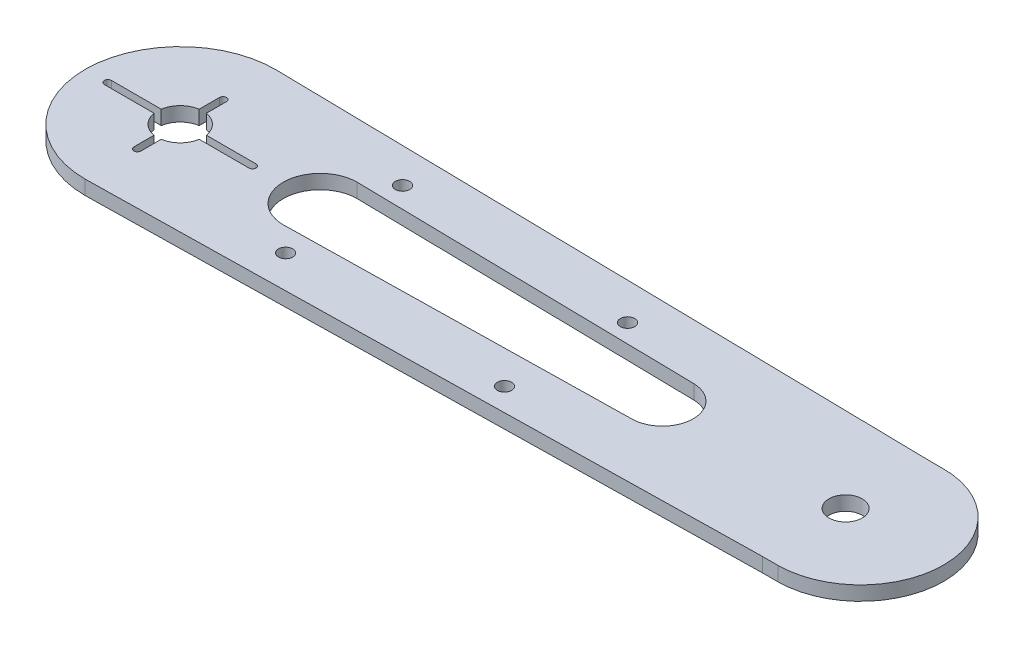
ISO-10303-21;
HEADER;
FILE_DESCRIPTION(('STEP AP214'),'2;1');
FILE_NAME('part.step','',(''),(''),'','','');
FILE_SCHEMA(('AUTOMOTIVE_DESIGN { 1 0 10303 214 1 1 1 1 }'));
ENDSEC;
DATA;
#1=APPLICATION_CONTEXT('core data for automotive mechanical design processes');
#2=APPLICATION_PROTOCOL_DEFINITION('international standard','automotive_design',2000,#1);
#3=PRODUCT_CONTEXT('',#1,'mechanical');
#4=PRODUCT('Part','Part','',(#3));
#5=PRODUCT_RELATED_PRODUCT_CATEGORY('part','',(#4));
#6=PRODUCT_DEFINITION_FORMATION('','',#4);
#7=PRODUCT_DEFINITION_CONTEXT('part definition',#1,'design');
#8=PRODUCT_DEFINITION('design','',#6,#7);
#9=PRODUCT_DEFINITION_SHAPE('','',#8);
#10=(LENGTH_UNIT() NAMED_UNIT(*) SI_UNIT(.MILLI.,.METRE.));
#11=(NAMED_UNIT(*) PLANE_ANGLE_UNIT() SI_UNIT($,.RADIAN.));
#12=(NAMED_UNIT(*) SI_UNIT($,.STERADIAN.) SOLID_ANGLE_UNIT());
#13=UNCERTAINTY_MEASURE_WITH_UNIT(LENGTH_MEASURE(1.E-05),#10,'distance_accuracy_value','');
#14=(GEOMETRIC_REPRESENTATION_CONTEXT(3) GLOBAL_UNCERTAINTY_ASSIGNED_CONTEXT((#13)) GLOBAL_UNIT_ASSIGNED_CONTEXT((#10,
#11,#12)) REPRESENTATION_CONTEXT('',''));
#15=CARTESIAN_POINT('',(0.,0.,0.));
#16=DIRECTION('',(0.,0.,1.));
#17=DIRECTION('',(1.,0.,0.));
#18=AXIS2_PLACEMENT_3D('',#15,#16,#17);
#19=CARTESIAN_POINT('',(0.,3.,0.));
#20=DIRECTION('',(0.,1.,0.));
#21=DIRECTION('',(0.,0.,1.));
#22=AXIS2_PLACEMENT_3D('',#19,#20,#21);
#23=PLANE('',#22);
#24=CARTESIAN_POINT('',(34.5416560076669,3.,-12.2314747346436));
#25=DIRECTION('',(0.,1.,0.));
#26=DIRECTION('',(0.,0.,1.));
#27=AXIS2_PLACEMENT_3D('',#24,#25,#26);
#28=CIRCLE('',#27,1.5);
#29=CARTESIAN_POINT('',(34.5416560076669,3.,-10.7314747346435));
#30=VERTEX_POINT('',#29);
#31=EDGE_CURVE('E314',#30,#30,#28,.T.);
#32=ORIENTED_EDGE('',*,*,#31,.F.);
#33=EDGE_LOOP('',(#32));
#34=FACE_BOUND('',#33,.T.);
#35=CARTESIAN_POINT('',(83.1945600648679,3.,-10.9224438629721));
#36=DIRECTION('',(0.,1.,0.));
#37=DIRECTION('',(0.,0.,1.));
#38=AXIS2_PLACEMENT_3D('',#35,#36,#37);
#39=CIRCLE('',#38,1.5);
#40=CARTESIAN_POINT('',(83.1945600648679,3.,-9.42244386297211));
#41=VERTEX_POINT('',#40);
#42=EDGE_CURVE('E321',#41,#41,#39,.T.);
#43=ORIENTED_EDGE('',*,*,#42,.F.);
#44=EDGE_LOOP('',(#43));
#45=FACE_BOUND('',#44,.T.);
#46=CARTESIAN_POINT('',(81.8715113944771,3.,13.6467101056128));
#47=DIRECTION('',(0.,1.,0.));
#48=DIRECTION('',(0.,0.,1.));
#49=AXIS2_PLACEMENT_3D('',#46,#47,#48);
#50=CIRCLE('',#49,1.5);
#51=CARTESIAN_POINT('',(81.8715113944771,3.,15.1467101056128));
#52=VERTEX_POINT('',#51);
#53=EDGE_CURVE('E316',#52,#52,#50,.T.);
#54=ORIENTED_EDGE('',*,*,#53,.F.);
#55=EDGE_LOOP('',(#54));
#56=FACE_BOUND('',#55,.T.);
#57=CARTESIAN_POINT('',(34.5416560076669,3.,12.373276524336));
#58=DIRECTION('',(0.,1.,0.));
#59=DIRECTION('',(0.,0.,1.));
#60=AXIS2_PLACEMENT_3D('',#57,#58,#59);
#61=CIRCLE('',#60,1.5);
#62=CARTESIAN_POINT('',(34.5416560076669,3.,13.873276524336));
#63=VERTEX_POINT('',#62);
#64=EDGE_CURVE('E320',#63,#63,#61,.T.);
#65=ORIENTED_EDGE('',*,*,#64,.F.);
#66=EDGE_LOOP('',(#65));
#67=FACE_BOUND('',#66,.T.);
#68=CARTESIAN_POINT('',(140.,3.,0.));
#69=DIRECTION('',(0.,1.,0.));
#70=DIRECTION('',(0.,0.,1.));
#71=AXIS2_PLACEMENT_3D('',#68,#69,#70);
#72=CIRCLE('',#71,3.49999999999999);
#73=CARTESIAN_POINT('',(140.,3.,3.49999999999999));
#74=VERTEX_POINT('',#73);
#75=EDGE_CURVE('E337',#74,#74,#72,.T.);
#76=ORIENTED_EDGE('',*,*,#75,.F.);
#77=EDGE_LOOP('',(#76));
#78=FACE_BOUND('',#77,.T.);
#79=DIRECTION('',(-0.999840599345445,0.,0.0178542964168829));
#80=VECTOR('',#79,1.);
#81=CARTESIAN_POINT('',(0.357029008606949,3.,19.9936244819892));
#82=LINE('',#81,#80);
#83=CARTESIAN_POINT('',(140.,3.,17.5));
#84=VERTEX_POINT('',#83);
#85=CARTESIAN_POINT('',(0.,3.,20.));
#86=VERTEX_POINT('',#85);
#87=EDGE_CURVE('E504',#84,#86,#82,.T.);
#88=ORIENTED_EDGE('',*,*,#87,.F.);
#89=DIRECTION('',(1.,0.,0.));
#90=VECTOR('',#89,1.);
#91=CARTESIAN_POINT('',(143.30110747715,3.,17.5));
#92=LINE('',#91,#90);
#93=CARTESIAN_POINT('',(143.30110747715,3.,17.5));
#94=VERTEX_POINT('',#93);
#95=EDGE_CURVE('E299',#84,#94,#92,.T.);
#96=ORIENTED_EDGE('',*,*,#95,.T.);
#97=CARTESIAN_POINT('',(143.13337203176,3.,0.000803880738995593));
#98=DIRECTION('',(0.,1.,0.));
#99=DIRECTION('',(0.,0.,1.));
#100=AXIS2_PLACEMENT_3D('',#97,#98,#99);
#101=CIRCLE('',#100,17.5);
#102=CARTESIAN_POINT('',(142.869697489549,3.,-17.4972095989618));
#103=VERTEX_POINT('',#102);
#104=EDGE_CURVE('E308',#94,#103,#101,.T.);
#105=ORIENTED_EDGE('',*,*,#104,.T.);
#106=DIRECTION('',(-1.,0.,0.));
#107=VECTOR('',#106,1.);
#108=CARTESIAN_POINT('',(140.3125,3.,-17.4972095989618));
#109=LINE('',#108,#107);
#110=CARTESIAN_POINT('',(140.3125,3.,-17.4972095989618));
#111=VERTEX_POINT('',#110);
#112=EDGE_CURVE('E274',#103,#111,#109,.T.);
#113=ORIENTED_EDGE('',*,*,#112,.T.);
#114=DIRECTION('',(0.999840548512101,0.,0.0178571428571428));
#115=VECTOR('',#114,1.);
#116=CARTESIAN_POINT('',(0.357142857142856,3.,-19.996810970242));
#117=LINE('',#116,#115);
#118=CARTESIAN_POINT('',(0.357142857142857,3.,-19.996810970242));
#119=VERTEX_POINT('',#118);
#120=EDGE_CURVE('E508',#119,#111,#117,.T.);
#121=ORIENTED_EDGE('',*,*,#120,.F.);
#122=CARTESIAN_POINT('',(0.,3.,0.));
#123=DIRECTION('',(0.,1.,0.));
#124=DIRECTION('',(0.,0.,1.));
#125=AXIS2_PLACEMENT_3D('',#122,#123,#124);
#126=CIRCLE('',#125,20.);
#127=EDGE_CURVE('E513',#119,#86,#126,.T.);
#128=ORIENTED_EDGE('',*,*,#127,.T.);
#129=EDGE_LOOP('',(#88,#96,#105,#113,#121,#128));
#130=FACE_BOUND('',#129,.T.);
#131=DIRECTION('',(-0.999840548512101,0.,-0.0178571428571486));
#132=VECTOR('',#131,1.);
#133=CARTESIAN_POINT('',(0.153184026665754,3.,-8.57693766970494));
#134=LINE('',#133,#132);
#135=CARTESIAN_POINT('',(101.283865866767,3.,-6.77074463667885));
#136=VERTEX_POINT('',#135);
#137=CARTESIAN_POINT('',(29.1730446968037,3.,-8.05864322920403));
#138=VERTEX_POINT('',#137);
#139=EDGE_CURVE('E468',#136,#138,#134,.T.);
#140=ORIENTED_EDGE('',*,*,#139,.F.);
#141=CARTESIAN_POINT('',(101.157834128344,3.,-0.288766187509077));
#142=DIRECTION('',(0.,1.,0.));
#143=DIRECTION('',(0.,0.,1.));
#144=AXIS2_PLACEMENT_3D('',#141,#142,#143);
#145=CIRCLE('',#144,6.48320357651921);
#146=CARTESIAN_POINT('',(101.494647455368,3.,6.18568246834806));
#147=VERTEX_POINT('',#146);
#148=EDGE_CURVE('E369',#136,#147,#145,.F.);
#149=ORIENTED_EDGE('',*,*,#148,.T.);
#150=DIRECTION('',(0.999840599345445,0.,-0.0178542964168771));
#151=VECTOR('',#150,1.);
#152=CARTESIAN_POINT('',(0.142777451604297,3.,7.99553728984324));
#153=LINE('',#152,#151);
#154=CARTESIAN_POINT('',(29.1575998035354,3.,7.47741546213036));
#155=VERTEX_POINT('',#154);
#156=EDGE_CURVE('E452',#155,#147,#153,.T.);
#157=ORIENTED_EDGE('',*,*,#156,.F.);
#158=CARTESIAN_POINT('',(29.1653222501695,3.,-0.290613883536413));
#159=DIRECTION('',(0.,1.,0.));
#160=DIRECTION('',(0.,0.,1.));
#161=AXIS2_PLACEMENT_3D('',#158,#159,#160);
#162=CIRCLE('',#161,7.76803318423194);
#163=EDGE_CURVE('E472',#138,#155,#162,.T.);
#164=ORIENTED_EDGE('',*,*,#163,.F.);
#165=EDGE_LOOP('',(#140,#149,#157,#164));
#166=FACE_BOUND('',#165,.T.);
#167=CARTESIAN_POINT('',(0.,3.,0.));
#168=DIRECTION('',(0.,1.,0.));
#169=DIRECTION('',(0.,0.,1.));
#170=AXIS2_PLACEMENT_3D('',#167,#168,#169);
#171=CIRCLE('',#170,4.8);
#172=CARTESIAN_POINT('',(-4.74104418878373,3.,0.75));
#173=VERTEX_POINT('',#172);
#174=CARTESIAN_POINT('',(-0.749999999999998,3.,4.74104418878373));
#175=VERTEX_POINT('',#174);
#176=EDGE_CURVE('E482',#173,#175,#171,.T.);
#177=ORIENTED_EDGE('',*,*,#176,.F.);
#178=DIRECTION('',(1.,0.,0.));
#179=VECTOR('',#178,1.);
#180=CARTESIAN_POINT('',(0.,3.,0.75));
#181=LINE('',#180,#179);
#182=CARTESIAN_POINT('',(-15.22,3.,0.75));
#183=VERTEX_POINT('',#182);
#184=EDGE_CURVE('E349',#183,#173,#181,.T.);
#185=ORIENTED_EDGE('',*,*,#184,.F.);
#186=CARTESIAN_POINT('',(-15.22,3.,0.));
#187=DIRECTION('',(0.,1.,0.));
#188=DIRECTION('',(0.,0.,1.));
#189=AXIS2_PLACEMENT_3D('',#186,#187,#188);
#190=CIRCLE('',#189,0.75);
#191=CARTESIAN_POINT('',(-15.22,3.,-0.75));
#192=VERTEX_POINT('',#191);
#193=EDGE_CURVE('E345',#192,#183,#190,.T.);
#194=ORIENTED_EDGE('',*,*,#193,.F.);
#195=DIRECTION('',(1.,0.,0.));
#196=VECTOR('',#195,1.);
#197=CARTESIAN_POINT('',(0.,3.,-0.75));
#198=LINE('',#197,#196);
#199=CARTESIAN_POINT('',(-4.74104418878373,3.,-0.75));
#200=VERTEX_POINT('',#199);
#201=EDGE_CURVE('E341',#192,#200,#198,.T.);
#202=ORIENTED_EDGE('',*,*,#201,.T.);
#203=CARTESIAN_POINT('',(-0.749999999999998,3.,-4.74104418878373));
#204=VERTEX_POINT('',#203);
#205=EDGE_CURVE('E764',#204,#200,#171,.T.);
#206=ORIENTED_EDGE('',*,*,#205,.F.);
#207=DIRECTION('',(0.,0.,-1.));
#208=VECTOR('',#207,1.);
#209=CARTESIAN_POINT('',(-0.749999999999998,3.,0.));
#210=LINE('',#209,#208);
#211=CARTESIAN_POINT('',(-0.749999999999998,3.,-9.));
#212=VERTEX_POINT('',#211);
#213=EDGE_CURVE('E110',#204,#212,#210,.T.);
#214=ORIENTED_EDGE('',*,*,#213,.T.);
#215=CARTESIAN_POINT('',(0.,3.,-9.));
#216=DIRECTION('',(0.,1.,0.));
#217=DIRECTION('',(0.,0.,1.));
#218=AXIS2_PLACEMENT_3D('',#215,#216,#217);
#219=CIRCLE('',#218,0.75);
#220=CARTESIAN_POINT('',(0.750000000000001,3.,-9.));
#221=VERTEX_POINT('',#220);
#222=EDGE_CURVE('E373',#221,#212,#219,.T.);
#223=ORIENTED_EDGE('',*,*,#222,.F.);
#224=DIRECTION('',(0.,0.,-1.));
#225=VECTOR('',#224,1.);
#226=CARTESIAN_POINT('',(0.750000000000001,3.,0.));
#227=LINE('',#226,#225);
#228=CARTESIAN_POINT('',(0.750000000000001,3.,-4.74104418878373));
#229=VERTEX_POINT('',#228);
#230=EDGE_CURVE('E370',#229,#221,#227,.T.);
#231=ORIENTED_EDGE('',*,*,#230,.F.);
#232=CARTESIAN_POINT('',(4.74104418878373,3.,-0.75));
#233=VERTEX_POINT('',#232);
#234=EDGE_CURVE('E503',#233,#229,#171,.T.);
#235=ORIENTED_EDGE('',*,*,#234,.F.);
#236=DIRECTION('',(1.,0.,0.));
#237=VECTOR('',#236,1.);
#238=CARTESIAN_POINT('',(-15.22,3.,-0.75));
#239=LINE('',#238,#237);
#240=CARTESIAN_POINT('',(15.22,3.,-0.75));
#241=VERTEX_POINT('',#240);
#242=EDGE_CURVE('E118',#233,#241,#239,.T.);
#243=ORIENTED_EDGE('',*,*,#242,.T.);
#244=CARTESIAN_POINT('',(15.22,3.,0.));
#245=DIRECTION('',(0.,1.,0.));
#246=DIRECTION('',(0.,0.,1.));
#247=AXIS2_PLACEMENT_3D('',#244,#245,#246);
#248=CIRCLE('',#247,0.75);
#249=CARTESIAN_POINT('',(15.22,3.,0.75));
#250=VERTEX_POINT('',#249);
#251=EDGE_CURVE('E427',#250,#241,#248,.T.);
#252=ORIENTED_EDGE('',*,*,#251,.F.);
#253=DIRECTION('',(1.,0.,0.));
#254=VECTOR('',#253,1.);
#255=CARTESIAN_POINT('',(-15.22,3.,0.75));
#256=LINE('',#255,#254);
#257=CARTESIAN_POINT('',(4.74104418878373,3.,0.75));
#258=VERTEX_POINT('',#257);
#259=EDGE_CURVE('E424',#258,#250,#256,.T.);
#260=ORIENTED_EDGE('',*,*,#259,.F.);
#261=CARTESIAN_POINT('',(0.750000000000001,3.,4.74104418878373));
#262=VERTEX_POINT('',#261);
#263=EDGE_CURVE('E499',#262,#258,#171,.T.);
#264=ORIENTED_EDGE('',*,*,#263,.F.);
#265=DIRECTION('',(0.,0.,-1.));
#266=VECTOR('',#265,1.);
#267=CARTESIAN_POINT('',(0.750000000000001,3.,0.));
#268=LINE('',#267,#266);
#269=CARTESIAN_POINT('',(0.750000000000001,3.,9.));
#270=VERTEX_POINT('',#269);
#271=EDGE_CURVE('E405',#270,#262,#268,.T.);
#272=ORIENTED_EDGE('',*,*,#271,.F.);
#273=CARTESIAN_POINT('',(0.,3.,9.));
#274=DIRECTION('',(0.,1.,0.));
#275=DIRECTION('',(0.,0.,1.));
#276=AXIS2_PLACEMENT_3D('',#273,#274,#275);
#277=CIRCLE('',#276,0.75);
#278=CARTESIAN_POINT('',(-0.749999999999998,3.,9.));
#279=VERTEX_POINT('',#278);
#280=EDGE_CURVE('E401',#279,#270,#277,.T.);
#281=ORIENTED_EDGE('',*,*,#280,.F.);
#282=DIRECTION('',(0.,0.,-1.));
#283=VECTOR('',#282,1.);
#284=CARTESIAN_POINT('',(-0.749999999999998,3.,0.));
#285=LINE('',#284,#283);
#286=EDGE_CURVE('E397',#279,#175,#285,.T.);
#287=ORIENTED_EDGE('',*,*,#286,.T.);
#288=EDGE_LOOP('',(#177,#185,#194,#202,#206,#214,#223,#231,#235,#243,#252,#260,#264,#272,#281,#287));
#289=FACE_BOUND('',#288,.T.);
#290=ADVANCED_FACE('F92',(#34,#45,#56,#67,#78,#130,#166,#289),#23,.T.);
#291=CARTESIAN_POINT('',(0.,0.,0.));
#292=DIRECTION('',(0.,1.,0.));
#293=DIRECTION('',(0.,0.,1.));
#294=AXIS2_PLACEMENT_3D('',#291,#292,#293);
#295=PLANE('',#294);
#296=CARTESIAN_POINT('',(34.5416560076669,0.,-12.2314747346436));
#297=DIRECTION('',(0.,1.,0.));
#298=DIRECTION('',(0.,0.,1.));
#299=AXIS2_PLACEMENT_3D('',#296,#297,#298);
#300=CIRCLE('',#299,1.5);
#301=CARTESIAN_POINT('',(34.5416560076669,0.,-10.7314747346435));
#302=VERTEX_POINT('',#301);
#303=EDGE_CURVE('E96',#302,#302,#300,.T.);
#304=ORIENTED_EDGE('',*,*,#303,.T.);
#305=EDGE_LOOP('',(#304));
#306=FACE_BOUND('',#305,.T.);
#307=CARTESIAN_POINT('',(83.1945600648679,0.,-10.9224438629721));
#308=DIRECTION('',(0.,1.,0.));
#309=DIRECTION('',(0.,0.,1.));
#310=AXIS2_PLACEMENT_3D('',#307,#308,#309);
#311=CIRCLE('',#310,1.5);
#312=CARTESIAN_POINT('',(83.1945600648679,0.,-9.42244386297211));
#313=VERTEX_POINT('',#312);
#314=EDGE_CURVE('E563',#313,#313,#311,.T.);
#315=ORIENTED_EDGE('',*,*,#314,.T.);
#316=EDGE_LOOP('',(#315));
#317=FACE_BOUND('',#316,.T.);
#318=CARTESIAN_POINT('',(81.8715113944771,0.,13.6467101056128));
#319=DIRECTION('',(0.,1.,0.));
#320=DIRECTION('',(0.,0.,1.));
#321=AXIS2_PLACEMENT_3D('',#318,#319,#320);
#322=CIRCLE('',#321,1.5);
#323=CARTESIAN_POINT('',(81.8715113944771,0.,15.1467101056128));
#324=VERTEX_POINT('',#323);
#325=EDGE_CURVE('E560',#324,#324,#322,.T.);
#326=ORIENTED_EDGE('',*,*,#325,.T.);
#327=EDGE_LOOP('',(#326));
#328=FACE_BOUND('',#327,.T.);
#329=CARTESIAN_POINT('',(34.5416560076669,0.,12.373276524336));
#330=DIRECTION('',(0.,1.,0.));
#331=DIRECTION('',(0.,0.,1.));
#332=AXIS2_PLACEMENT_3D('',#329,#330,#331);
#333=CIRCLE('',#332,1.5);
#334=CARTESIAN_POINT('',(34.5416560076669,0.,13.873276524336));
#335=VERTEX_POINT('',#334);
#336=EDGE_CURVE('E331',#335,#335,#333,.T.);
#337=ORIENTED_EDGE('',*,*,#336,.T.);
#338=EDGE_LOOP('',(#337));
#339=FACE_BOUND('',#338,.T.);
#340=CARTESIAN_POINT('',(140.,0.,0.));
#341=DIRECTION('',(0.,1.,0.));
#342=DIRECTION('',(0.,0.,1.));
#343=AXIS2_PLACEMENT_3D('',#340,#341,#342);
#344=CIRCLE('',#343,3.49999999999999);
#345=CARTESIAN_POINT('',(140.,0.,3.49999999999999));
#346=VERTEX_POINT('',#345);
#347=EDGE_CURVE('E332',#346,#346,#344,.T.);
#348=ORIENTED_EDGE('',*,*,#347,.T.);
#349=EDGE_LOOP('',(#348));
#350=FACE_BOUND('',#349,.T.);
#351=DIRECTION('',(-0.999840599345445,0.,0.0178542964168829));
#352=VECTOR('',#351,1.);
#353=CARTESIAN_POINT('',(0.357029008606949,0.,19.9936244819892));
#354=LINE('',#353,#352);
#355=CARTESIAN_POINT('',(140.,0.,17.5));
#356=VERTEX_POINT('',#355);
#357=CARTESIAN_POINT('',(0.,0.,20.));
#358=VERTEX_POINT('',#357);
#359=EDGE_CURVE('E496',#356,#358,#354,.T.);
#360=ORIENTED_EDGE('',*,*,#359,.T.);
#361=CARTESIAN_POINT('',(0.,0.,0.));
#362=DIRECTION('',(0.,1.,0.));
#363=DIRECTION('',(0.,0.,1.));
#364=AXIS2_PLACEMENT_3D('',#361,#362,#363);
#365=CIRCLE('',#364,20.);
#366=CARTESIAN_POINT('',(0.357142857142857,0.,-19.996810970242));
#367=VERTEX_POINT('',#366);
#368=EDGE_CURVE('E509',#367,#358,#365,.T.);
#369=ORIENTED_EDGE('',*,*,#368,.F.);
#370=DIRECTION('',(0.999840548512101,0.,0.0178571428571428));
#371=VECTOR('',#370,1.);
#372=CARTESIAN_POINT('',(0.357142857142856,0.,-19.996810970242));
#373=LINE('',#372,#371);
#374=CARTESIAN_POINT('',(140.3125,0.,-17.4972095989618));
#375=VERTEX_POINT('',#374);
#376=EDGE_CURVE('E294',#367,#375,#373,.T.);
#377=ORIENTED_EDGE('',*,*,#376,.T.);
#378=DIRECTION('',(-1.,0.,0.));
#379=VECTOR('',#378,1.);
#380=CARTESIAN_POINT('',(140.3125,0.,-17.4972095989618));
#381=LINE('',#380,#379);
#382=CARTESIAN_POINT('',(142.869697489549,0.,-17.4972095989618));
#383=VERTEX_POINT('',#382);
#384=EDGE_CURVE('E271',#383,#375,#381,.T.);
#385=ORIENTED_EDGE('',*,*,#384,.F.);
#386=CARTESIAN_POINT('',(143.13337203176,0.,0.000803880738995593));
#387=DIRECTION('',(0.,1.,0.));
#388=DIRECTION('',(0.,0.,1.));
#389=AXIS2_PLACEMENT_3D('',#386,#387,#388);
#390=CIRCLE('',#389,17.5);
#391=CARTESIAN_POINT('',(143.30110747715,0.,17.5));
#392=VERTEX_POINT('',#391);
#393=EDGE_CURVE('E290',#392,#383,#390,.T.);
#394=ORIENTED_EDGE('',*,*,#393,.F.);
#395=DIRECTION('',(1.,0.,0.));
#396=VECTOR('',#395,1.);
#397=CARTESIAN_POINT('',(143.30110747715,0.,17.5));
#398=LINE('',#397,#396);
#399=EDGE_CURVE('E281',#356,#392,#398,.T.);
#400=ORIENTED_EDGE('',*,*,#399,.F.);
#401=EDGE_LOOP('',(#360,#369,#377,#385,#394,#400));
#402=FACE_BOUND('',#401,.T.);
#403=CARTESIAN_POINT('',(101.157834128344,0.,-0.288766187509077));
#404=DIRECTION('',(0.,1.,0.));
#405=DIRECTION('',(0.,0.,1.));
#406=AXIS2_PLACEMENT_3D('',#403,#404,#405);
#407=CIRCLE('',#406,6.48320357651921);
#408=CARTESIAN_POINT('',(101.283865866767,0.,-6.77074463667885));
#409=VERTEX_POINT('',#408);
#410=CARTESIAN_POINT('',(101.494647455368,0.,6.18568246834806));
#411=VERTEX_POINT('',#410);
#412=EDGE_CURVE('E448',#409,#411,#407,.F.);
#413=ORIENTED_EDGE('',*,*,#412,.F.);
#414=DIRECTION('',(-0.999840548512101,0.,-0.0178571428571486));
#415=VECTOR('',#414,1.);
#416=CARTESIAN_POINT('',(0.153184026665754,0.,-8.57693766970494));
#417=LINE('',#416,#415);
#418=CARTESIAN_POINT('',(29.1730446968037,0.,-8.05864322920403));
#419=VERTEX_POINT('',#418);
#420=EDGE_CURVE('E451',#409,#419,#417,.T.);
#421=ORIENTED_EDGE('',*,*,#420,.T.);
#422=CARTESIAN_POINT('',(29.1653222501695,0.,-0.290613883536413));
#423=DIRECTION('',(0.,1.,0.));
#424=DIRECTION('',(0.,0.,1.));
#425=AXIS2_PLACEMENT_3D('',#422,#423,#424);
#426=CIRCLE('',#425,7.76803318423194);
#427=CARTESIAN_POINT('',(29.1575998035354,0.,7.47741546213036));
#428=VERTEX_POINT('',#427);
#429=EDGE_CURVE('E456',#419,#428,#426,.T.);
#430=ORIENTED_EDGE('',*,*,#429,.T.);
#431=DIRECTION('',(0.999840599345445,0.,-0.0178542964168771));
#432=VECTOR('',#431,1.);
#433=CARTESIAN_POINT('',(0.142777451604297,0.,7.99553728984324));
#434=LINE('',#433,#432);
#435=EDGE_CURVE('E460',#428,#411,#434,.T.);
#436=ORIENTED_EDGE('',*,*,#435,.T.);
#437=EDGE_LOOP('',(#413,#421,#430,#436));
#438=FACE_BOUND('',#437,.T.);
#439=DIRECTION('',(1.,0.,0.));
#440=VECTOR('',#439,1.);
#441=CARTESIAN_POINT('',(0.,0.,0.75));
#442=LINE('',#441,#440);
#443=CARTESIAN_POINT('',(-15.22,0.,0.75));
#444=VERTEX_POINT('',#443);
#445=CARTESIAN_POINT('',(-4.74104418878373,0.,0.75));
#446=VERTEX_POINT('',#445);
#447=EDGE_CURVE('E346',#444,#446,#442,.T.);
#448=ORIENTED_EDGE('',*,*,#447,.T.);
#449=CARTESIAN_POINT('',(0.,0.,0.));
#450=DIRECTION('',(0.,1.,0.));
#451=DIRECTION('',(0.,0.,1.));
#452=AXIS2_PLACEMENT_3D('',#449,#450,#451);
#453=CIRCLE('',#452,4.8);
#454=CARTESIAN_POINT('',(-0.749999999999998,0.,4.74104418878373));
#455=VERTEX_POINT('',#454);
#456=EDGE_CURVE('E498',#446,#455,#453,.T.);
#457=ORIENTED_EDGE('',*,*,#456,.T.);
#458=DIRECTION('',(0.,0.,-1.));
#459=VECTOR('',#458,1.);
#460=CARTESIAN_POINT('',(-0.749999999999998,0.,0.));
#461=LINE('',#460,#459);
#462=CARTESIAN_POINT('',(-0.749999999999998,0.,9.));
#463=VERTEX_POINT('',#462);
#464=EDGE_CURVE('E409',#463,#455,#461,.T.);
#465=ORIENTED_EDGE('',*,*,#464,.F.);
#466=CARTESIAN_POINT('',(0.,0.,9.));
#467=DIRECTION('',(0.,1.,0.));
#468=DIRECTION('',(0.,0.,1.));
#469=AXIS2_PLACEMENT_3D('',#466,#467,#468);
#470=CIRCLE('',#469,0.75);
#471=CARTESIAN_POINT('',(0.750000000000001,0.,9.));
#472=VERTEX_POINT('',#471);
#473=EDGE_CURVE('E412',#463,#472,#470,.T.);
#474=ORIENTED_EDGE('',*,*,#473,.T.);
#475=DIRECTION('',(0.,0.,-1.));
#476=VECTOR('',#475,1.);
#477=CARTESIAN_POINT('',(0.750000000000001,0.,0.));
#478=LINE('',#477,#476);
#479=CARTESIAN_POINT('',(0.750000000000001,0.,4.74104418878373));
#480=VERTEX_POINT('',#479);
#481=EDGE_CURVE('E402',#472,#480,#478,.T.);
#482=ORIENTED_EDGE('',*,*,#481,.T.);
#483=CARTESIAN_POINT('',(4.74104418878373,0.,0.75));
#484=VERTEX_POINT('',#483);
#485=EDGE_CURVE('E492',#480,#484,#453,.T.);
#486=ORIENTED_EDGE('',*,*,#485,.T.);
#487=DIRECTION('',(1.,0.,0.));
#488=VECTOR('',#487,1.);
#489=CARTESIAN_POINT('',(-15.22,0.,0.75));
#490=LINE('',#489,#488);
#491=CARTESIAN_POINT('',(15.22,0.,0.75));
#492=VERTEX_POINT('',#491);
#493=EDGE_CURVE('E336',#484,#492,#490,.T.);
#494=ORIENTED_EDGE('',*,*,#493,.T.);
#495=CARTESIAN_POINT('',(15.22,0.,0.));
#496=DIRECTION('',(0.,1.,0.));
#497=DIRECTION('',(0.,0.,1.));
#498=AXIS2_PLACEMENT_3D('',#495,#496,#497);
#499=CIRCLE('',#498,0.75);
#500=CARTESIAN_POINT('',(15.22,0.,-0.75));
#501=VERTEX_POINT('',#500);
#502=EDGE_CURVE('E437',#492,#501,#499,.T.);
#503=ORIENTED_EDGE('',*,*,#502,.T.);
#504=DIRECTION('',(1.,0.,0.));
#505=VECTOR('',#504,1.);
#506=CARTESIAN_POINT('',(-15.22,0.,-0.75));
#507=LINE('',#506,#505);
#508=CARTESIAN_POINT('',(4.74104418878373,0.,-0.75));
#509=VERTEX_POINT('',#508);
#510=EDGE_CURVE('E428',#509,#501,#507,.T.);
#511=ORIENTED_EDGE('',*,*,#510,.F.);
#512=CARTESIAN_POINT('',(0.750000000000001,0.,-4.74104418878373));
#513=VERTEX_POINT('',#512);
#514=EDGE_CURVE('E497',#509,#513,#453,.T.);
#515=ORIENTED_EDGE('',*,*,#514,.T.);
#516=DIRECTION('',(0.,0.,-1.));
#517=VECTOR('',#516,1.);
#518=CARTESIAN_POINT('',(0.750000000000001,0.,0.));
#519=LINE('',#518,#517);
#520=CARTESIAN_POINT('',(0.750000000000001,0.,-9.));
#521=VERTEX_POINT('',#520);
#522=EDGE_CURVE('E380',#513,#521,#519,.T.);
#523=ORIENTED_EDGE('',*,*,#522,.T.);
#524=CARTESIAN_POINT('',(0.,0.,-9.));
#525=DIRECTION('',(0.,1.,0.));
#526=DIRECTION('',(0.,0.,1.));
#527=AXIS2_PLACEMENT_3D('',#524,#525,#526);
#528=CIRCLE('',#527,0.75);
#529=CARTESIAN_POINT('',(-0.749999999999998,0.,-9.));
#530=VERTEX_POINT('',#529);
#531=EDGE_CURVE('E384',#521,#530,#528,.T.);
#532=ORIENTED_EDGE('',*,*,#531,.T.);
#533=DIRECTION('',(0.,0.,-1.));
#534=VECTOR('',#533,1.);
#535=CARTESIAN_POINT('',(-0.749999999999998,0.,0.));
#536=LINE('',#535,#534);
#537=CARTESIAN_POINT('',(-0.749999999999998,0.,-4.74104418878373));
#538=VERTEX_POINT('',#537);
#539=EDGE_CURVE('E374',#538,#530,#536,.T.);
#540=ORIENTED_EDGE('',*,*,#539,.F.);
#541=CARTESIAN_POINT('',(-4.74104418878373,0.,-0.75));
#542=VERTEX_POINT('',#541);
#543=EDGE_CURVE('E742',#538,#542,#453,.T.);
#544=ORIENTED_EDGE('',*,*,#543,.T.);
#545=DIRECTION('',(1.,0.,0.));
#546=VECTOR('',#545,1.);
#547=CARTESIAN_POINT('',(0.,0.,-0.75));
#548=LINE('',#547,#546);
#549=CARTESIAN_POINT('',(-15.22,0.,-0.75));
#550=VERTEX_POINT('',#549);
#551=EDGE_CURVE('E353',#550,#542,#548,.T.);
#552=ORIENTED_EDGE('',*,*,#551,.F.);
#553=CARTESIAN_POINT('',(-15.22,0.,0.));
#554=DIRECTION('',(0.,1.,0.));
#555=DIRECTION('',(0.,0.,1.));
#556=AXIS2_PLACEMENT_3D('',#553,#554,#555);
#557=CIRCLE('',#556,0.75);
#558=EDGE_CURVE('E356',#550,#444,#557,.T.);
#559=ORIENTED_EDGE('',*,*,#558,.T.);
#560=EDGE_LOOP('',(#448,#457,#465,#474,#482,#486,#494,#503,#511,#515,#523,#532,#540,#544,#552,#559));
#561=FACE_BOUND('',#560,.T.);
#562=ADVANCED_FACE('F287',(#306,#317,#328,#339,#350,#402,#438,#561),#295,.F.);
#563=CARTESIAN_POINT('',(0.,0.,0.));
#564=DIRECTION('',(0.,1.,0.));
#565=DIRECTION('',(0.,0.,1.));
#566=AXIS2_PLACEMENT_3D('',#563,#564,#565);
#567=CYLINDRICAL_SURFACE('',#566,4.8);
#568=DIRECTION('',(0.,1.,0.));
#569=VECTOR('',#568,1.);
#570=CARTESIAN_POINT('',(-4.74104418878373,0.,0.75));
#571=LINE('',#570,#569);
#572=EDGE_CURVE('E12',#173,#446,#571,.F.);
#573=ORIENTED_EDGE('',*,*,#572,.F.);
#574=ORIENTED_EDGE('',*,*,#176,.T.);
#575=DIRECTION('',(0.,1.,0.));
#576=VECTOR('',#575,1.);
#577=CARTESIAN_POINT('',(-0.749999999999998,0.,4.74104418878373));
#578=LINE('',#577,#576);
#579=EDGE_CURVE('E535',#175,#455,#578,.F.);
#580=ORIENTED_EDGE('',*,*,#579,.T.);
#581=ORIENTED_EDGE('',*,*,#456,.F.);
#582=EDGE_LOOP('',(#573,#574,#580,#581));
#583=FACE_BOUND('',#582,.T.);
#584=ADVANCED_FACE('F596',(#583),#567,.F.);
#585=DIRECTION('',(0.,1.,0.));
#586=VECTOR('',#585,1.);
#587=CARTESIAN_POINT('',(0.750000000000001,0.,-4.74104418878373));
#588=LINE('',#587,#586);
#589=EDGE_CURVE('E551',#513,#229,#588,.T.);
#590=ORIENTED_EDGE('',*,*,#589,.F.);
#591=ORIENTED_EDGE('',*,*,#514,.F.);
#592=DIRECTION('',(0.,1.,0.));
#593=VECTOR('',#592,1.);
#594=CARTESIAN_POINT('',(4.74104418878373,0.,-0.75));
#595=LINE('',#594,#593);
#596=EDGE_CURVE('E542',#509,#233,#595,.T.);
#597=ORIENTED_EDGE('',*,*,#596,.T.);
#598=ORIENTED_EDGE('',*,*,#234,.T.);
#599=EDGE_LOOP('',(#590,#591,#597,#598));
#600=FACE_BOUND('',#599,.T.);
#601=ADVANCED_FACE('F756',(#600),#567,.F.);
#602=DIRECTION('',(0.,1.,0.));
#603=VECTOR('',#602,1.);
#604=CARTESIAN_POINT('',(0.750000000000001,0.,4.74104418878373));
#605=LINE('',#604,#603);
#606=EDGE_CURVE('E548',#262,#480,#605,.F.);
#607=ORIENTED_EDGE('',*,*,#606,.F.);
#608=ORIENTED_EDGE('',*,*,#263,.T.);
#609=DIRECTION('',(0.,1.,0.));
#610=VECTOR('',#609,1.);
#611=CARTESIAN_POINT('',(4.74104418878373,0.,0.75));
#612=LINE('',#611,#610);
#613=EDGE_CURVE('E545',#484,#258,#612,.T.);
#614=ORIENTED_EDGE('',*,*,#613,.F.);
#615=ORIENTED_EDGE('',*,*,#485,.F.);
#616=EDGE_LOOP('',(#607,#608,#614,#615));
#617=FACE_BOUND('',#616,.T.);
#618=ADVANCED_FACE('F613',(#617),#567,.F.);
#619=CARTESIAN_POINT('',(0.357029008606949,3.,19.9936244819892));
#620=DIRECTION('',(0.0178542964168829,0.,0.999840599345445));
#621=DIRECTION('',(0.999840599345445,0.,-0.0178542964168829));
#622=AXIS2_PLACEMENT_3D('',#619,#620,#621);
#623=PLANE('',#622);
#624=ORIENTED_EDGE('',*,*,#359,.F.);
#625=DIRECTION('',(0.,-1.,0.));
#626=VECTOR('',#625,1.);
#627=CARTESIAN_POINT('',(140.,3.,17.5));
#628=LINE('',#627,#626);
#629=EDGE_CURVE('E532',#84,#356,#628,.T.);
#630=ORIENTED_EDGE('',*,*,#629,.F.);
#631=ORIENTED_EDGE('',*,*,#87,.T.);
#632=DIRECTION('',(0.,-1.,0.));
#633=VECTOR('',#632,1.);
#634=CARTESIAN_POINT('',(0.,3.,20.));
#635=LINE('',#634,#633);
#636=EDGE_CURVE('E516',#86,#358,#635,.T.);
#637=ORIENTED_EDGE('',*,*,#636,.T.);
#638=EDGE_LOOP('',(#624,#630,#631,#637));
#639=FACE_BOUND('',#638,.T.);
#640=ADVANCED_FACE('F94',(#639),#623,.T.);
#641=CARTESIAN_POINT('',(0.357142857142856,3.,-19.996810970242));
#642=DIRECTION('',(0.0178571428571428,0.,-0.999840548512101));
#643=DIRECTION('',(-0.999840548512101,0.,-0.0178571428571428));
#644=AXIS2_PLACEMENT_3D('',#641,#642,#643);
#645=PLANE('',#644);
#646=ORIENTED_EDGE('',*,*,#376,.F.);
#647=DIRECTION('',(0.,-1.,0.));
#648=VECTOR('',#647,1.);
#649=CARTESIAN_POINT('',(0.357142857142857,3.,-19.996810970242));
#650=LINE('',#649,#648);
#651=EDGE_CURVE('E526',#119,#367,#650,.T.);
#652=ORIENTED_EDGE('',*,*,#651,.F.);
#653=ORIENTED_EDGE('',*,*,#120,.T.);
#654=DIRECTION('',(0.,-1.,0.));
#655=VECTOR('',#654,1.);
#656=CARTESIAN_POINT('',(140.3125,3.,-17.4972095989618));
#657=LINE('',#656,#655);
#658=EDGE_CURVE('E529',#111,#375,#657,.T.);
#659=ORIENTED_EDGE('',*,*,#658,.T.);
#660=EDGE_LOOP('',(#646,#652,#653,#659));
#661=FACE_BOUND('',#660,.T.);
#662=ADVANCED_FACE('F606',(#661),#645,.T.);
#663=CARTESIAN_POINT('',(0.,3.,0.));
#664=DIRECTION('',(0.,-1.,0.));
#665=DIRECTION('',(0.,0.,-1.));
#666=AXIS2_PLACEMENT_3D('',#663,#664,#665);
#667=CYLINDRICAL_SURFACE('',#666,20.);
#668=ORIENTED_EDGE('',*,*,#368,.T.);
#669=ORIENTED_EDGE('',*,*,#636,.F.);
#670=ORIENTED_EDGE('',*,*,#127,.F.);
#671=ORIENTED_EDGE('',*,*,#651,.T.);
#672=EDGE_LOOP('',(#668,#669,#670,#671));
#673=FACE_BOUND('',#672,.T.);
#674=ADVANCED_FACE('F604',(#673),#667,.T.);
#675=ORIENTED_EDGE('',*,*,#205,.T.);
#676=DIRECTION('',(0.,1.,0.));
#677=VECTOR('',#676,1.);
#678=CARTESIAN_POINT('',(-4.74104418878373,0.,-0.75));
#679=LINE('',#678,#677);
#680=EDGE_CURVE('E102',#200,#542,#679,.F.);
#681=ORIENTED_EDGE('',*,*,#680,.T.);
#682=ORIENTED_EDGE('',*,*,#543,.F.);
#683=DIRECTION('',(0.,1.,0.));
#684=VECTOR('',#683,1.);
#685=CARTESIAN_POINT('',(-0.749999999999998,0.,-4.74104418878373));
#686=LINE('',#685,#684);
#687=EDGE_CURVE('E539',#538,#204,#686,.T.);
#688=ORIENTED_EDGE('',*,*,#687,.T.);
#689=EDGE_LOOP('',(#675,#681,#682,#688));
#690=FACE_BOUND('',#689,.T.);
#691=ADVANCED_FACE('F601',(#690),#567,.F.);
#692=CARTESIAN_POINT('',(101.157834128344,0.,-0.288766187509077));
#693=DIRECTION('',(0.,1.,0.));
#694=DIRECTION('',(0.,0.,1.));
#695=AXIS2_PLACEMENT_3D('',#692,#693,#694);
#696=CYLINDRICAL_SURFACE('',#695,6.48320357651921);
#697=ORIENTED_EDGE('',*,*,#148,.F.);
#698=DIRECTION('',(0.,1.,0.));
#699=VECTOR('',#698,1.);
#700=CARTESIAN_POINT('',(101.283865866767,0.,-6.77074463667885));
#701=LINE('',#700,#699);
#702=EDGE_CURVE('E464',#409,#136,#701,.T.);
#703=ORIENTED_EDGE('',*,*,#702,.F.);
#704=ORIENTED_EDGE('',*,*,#412,.T.);
#705=DIRECTION('',(0.,1.,0.));
#706=VECTOR('',#705,1.);
#707=CARTESIAN_POINT('',(101.494647455368,0.,6.18568246834806));
#708=LINE('',#707,#706);
#709=EDGE_CURVE('E479',#411,#147,#708,.T.);
#710=ORIENTED_EDGE('',*,*,#709,.T.);
#711=EDGE_LOOP('',(#697,#703,#704,#710));
#712=FACE_BOUND('',#711,.T.);
#713=ADVANCED_FACE('F707',(#712),#696,.F.);
#714=CARTESIAN_POINT('',(0.142777451604297,0.,7.99553728984324));
#715=DIRECTION('',(0.0178542964168771,0.,0.999840599345445));
#716=DIRECTION('',(0.999840599345445,0.,-0.0178542964168771));
#717=AXIS2_PLACEMENT_3D('',#714,#715,#716);
#718=PLANE('',#717);
#719=ORIENTED_EDGE('',*,*,#156,.T.);
#720=ORIENTED_EDGE('',*,*,#709,.F.);
#721=ORIENTED_EDGE('',*,*,#435,.F.);
#722=DIRECTION('',(0.,1.,0.));
#723=VECTOR('',#722,1.);
#724=CARTESIAN_POINT('',(29.1575998035354,0.,7.47741546213036));
#725=LINE('',#724,#723);
#726=EDGE_CURVE('E483',#428,#155,#725,.T.);
#727=ORIENTED_EDGE('',*,*,#726,.T.);
#728=EDGE_LOOP('',(#719,#720,#721,#727));
#729=FACE_BOUND('',#728,.T.);
#730=ADVANCED_FACE('F703',(#729),#718,.F.);
#731=CARTESIAN_POINT('',(29.1653222501695,0.,-0.290613883536413));
#732=DIRECTION('',(0.,1.,0.));
#733=DIRECTION('',(0.,0.,1.));
#734=AXIS2_PLACEMENT_3D('',#731,#732,#733);
#735=CYLINDRICAL_SURFACE('',#734,7.76803318423194);
#736=ORIENTED_EDGE('',*,*,#163,.T.);
#737=ORIENTED_EDGE('',*,*,#726,.F.);
#738=ORIENTED_EDGE('',*,*,#429,.F.);
#739=DIRECTION('',(0.,1.,0.));
#740=VECTOR('',#739,1.);
#741=CARTESIAN_POINT('',(29.1730446968037,0.,-8.05864322920403));
#742=LINE('',#741,#740);
#743=EDGE_CURVE('E486',#419,#138,#742,.T.);
#744=ORIENTED_EDGE('',*,*,#743,.T.);
#745=EDGE_LOOP('',(#736,#737,#738,#744));
#746=FACE_BOUND('',#745,.T.);
#747=ADVANCED_FACE('F706',(#746),#735,.F.);
#748=CARTESIAN_POINT('',(0.153184026665754,0.,-8.57693766970494));
#749=DIRECTION('',(0.0178571428571486,0.,-0.999840548512101));
#750=DIRECTION('',(-0.999840548512101,0.,-0.0178571428571486));
#751=AXIS2_PLACEMENT_3D('',#748,#749,#750);
#752=PLANE('',#751);
#753=ORIENTED_EDGE('',*,*,#139,.T.);
#754=ORIENTED_EDGE('',*,*,#743,.F.);
#755=ORIENTED_EDGE('',*,*,#420,.F.);
#756=ORIENTED_EDGE('',*,*,#702,.T.);
#757=EDGE_LOOP('',(#753,#754,#755,#756));
#758=FACE_BOUND('',#757,.T.);
#759=ADVANCED_FACE('F692',(#758),#752,.F.);
#760=CARTESIAN_POINT('',(-0.749999999999998,3.,0.));
#761=DIRECTION('',(-1.,0.,0.));
#762=DIRECTION('',(0.,0.,1.));
#763=AXIS2_PLACEMENT_3D('',#760,#761,#762);
#764=PLANE('',#763);
#765=ORIENTED_EDGE('',*,*,#286,.F.);
#766=DIRECTION('',(0.,-1.,0.));
#767=VECTOR('',#766,1.);
#768=CARTESIAN_POINT('',(-0.749999999999998,3.,9.));
#769=LINE('',#768,#767);
#770=EDGE_CURVE('E385',#279,#463,#769,.T.);
#771=ORIENTED_EDGE('',*,*,#770,.T.);
#772=ORIENTED_EDGE('',*,*,#464,.T.);
#773=ORIENTED_EDGE('',*,*,#579,.F.);
#774=EDGE_LOOP('',(#765,#771,#772,#773));
#775=FACE_BOUND('',#774,.T.);
#776=ADVANCED_FACE('F685',(#775),#764,.F.);
#777=CARTESIAN_POINT('',(0.750000000000001,3.,0.));
#778=DIRECTION('',(-1.,0.,0.));
#779=DIRECTION('',(0.,0.,1.));
#780=AXIS2_PLACEMENT_3D('',#777,#778,#779);
#781=PLANE('',#780);
#782=ORIENTED_EDGE('',*,*,#606,.T.);
#783=ORIENTED_EDGE('',*,*,#481,.F.);
#784=DIRECTION('',(0.,-1.,0.));
#785=VECTOR('',#784,1.);
#786=CARTESIAN_POINT('',(0.750000000000001,3.,9.));
#787=LINE('',#786,#785);
#788=EDGE_CURVE('E408',#270,#472,#787,.T.);
#789=ORIENTED_EDGE('',*,*,#788,.F.);
#790=ORIENTED_EDGE('',*,*,#271,.T.);
#791=EDGE_LOOP('',(#782,#783,#789,#790));
#792=FACE_BOUND('',#791,.T.);
#793=ADVANCED_FACE('F682',(#792),#781,.T.);
#794=CARTESIAN_POINT('',(0.,3.,9.));
#795=DIRECTION('',(0.,-1.,0.));
#796=DIRECTION('',(0.,0.,-1.));
#797=AXIS2_PLACEMENT_3D('',#794,#795,#796);
#798=CYLINDRICAL_SURFACE('',#797,0.75);
#799=ORIENTED_EDGE('',*,*,#473,.F.);
#800=ORIENTED_EDGE('',*,*,#770,.F.);
#801=ORIENTED_EDGE('',*,*,#280,.T.);
#802=ORIENTED_EDGE('',*,*,#788,.T.);
#803=EDGE_LOOP('',(#799,#800,#801,#802));
#804=FACE_BOUND('',#803,.T.);
#805=ADVANCED_FACE('F680',(#804),#798,.F.);
#806=CARTESIAN_POINT('',(0.750000000000001,3.,0.));
#807=DIRECTION('',(-1.,0.,0.));
#808=DIRECTION('',(0.,0.,1.));
#809=AXIS2_PLACEMENT_3D('',#806,#807,#808);
#810=PLANE('',#809);
#811=ORIENTED_EDGE('',*,*,#589,.T.);
#812=ORIENTED_EDGE('',*,*,#230,.T.);
#813=DIRECTION('',(0.,-1.,0.));
#814=VECTOR('',#813,1.);
#815=CARTESIAN_POINT('',(0.750000000000001,3.,-9.));
#816=LINE('',#815,#814);
#817=EDGE_CURVE('E357',#221,#521,#816,.T.);
#818=ORIENTED_EDGE('',*,*,#817,.T.);
#819=ORIENTED_EDGE('',*,*,#522,.F.);
#820=EDGE_LOOP('',(#811,#812,#818,#819));
#821=FACE_BOUND('',#820,.T.);
#822=ADVANCED_FACE('F673',(#821),#810,.T.);
#823=CARTESIAN_POINT('',(-0.749999999999998,3.,0.));
#824=DIRECTION('',(-1.,0.,0.));
#825=DIRECTION('',(0.,0.,1.));
#826=AXIS2_PLACEMENT_3D('',#823,#824,#825);
#827=PLANE('',#826);
#828=ORIENTED_EDGE('',*,*,#539,.T.);
#829=DIRECTION('',(0.,-1.,0.));
#830=VECTOR('',#829,1.);
#831=CARTESIAN_POINT('',(-0.749999999999998,3.,-9.));
#832=LINE('',#831,#830);
#833=EDGE_CURVE('E379',#212,#530,#832,.T.);
#834=ORIENTED_EDGE('',*,*,#833,.F.);
#835=ORIENTED_EDGE('',*,*,#213,.F.);
#836=ORIENTED_EDGE('',*,*,#687,.F.);
#837=EDGE_LOOP('',(#828,#834,#835,#836));
#838=FACE_BOUND('',#837,.T.);
#839=ADVANCED_FACE('F669',(#838),#827,.F.);
#840=CARTESIAN_POINT('',(0.,3.,-9.));
#841=DIRECTION('',(0.,-1.,0.));
#842=DIRECTION('',(0.,0.,-1.));
#843=AXIS2_PLACEMENT_3D('',#840,#841,#842);
#844=CYLINDRICAL_SURFACE('',#843,0.75);
#845=ORIENTED_EDGE('',*,*,#531,.F.);
#846=ORIENTED_EDGE('',*,*,#817,.F.);
#847=ORIENTED_EDGE('',*,*,#222,.T.);
#848=ORIENTED_EDGE('',*,*,#833,.T.);
#849=EDGE_LOOP('',(#845,#846,#847,#848));
#850=FACE_BOUND('',#849,.T.);
#851=ADVANCED_FACE('F672',(#850),#844,.F.);
#852=CARTESIAN_POINT('',(-15.22,3.,0.75));
#853=DIRECTION('',(0.,0.,-1.));
#854=DIRECTION('',(-1.,0.,0.));
#855=AXIS2_PLACEMENT_3D('',#852,#853,#854);
#856=PLANE('',#855);
#857=ORIENTED_EDGE('',*,*,#613,.T.);
#858=ORIENTED_EDGE('',*,*,#259,.T.);
#859=DIRECTION('',(0.,-1.,0.));
#860=VECTOR('',#859,1.);
#861=CARTESIAN_POINT('',(15.22,3.,0.75));
#862=LINE('',#861,#860);
#863=EDGE_CURVE('E413',#250,#492,#862,.T.);
#864=ORIENTED_EDGE('',*,*,#863,.T.);
#865=ORIENTED_EDGE('',*,*,#493,.F.);
#866=EDGE_LOOP('',(#857,#858,#864,#865));
#867=FACE_BOUND('',#866,.T.);
#868=ADVANCED_FACE('F676',(#867),#856,.T.);
#869=CARTESIAN_POINT('',(-15.22,3.,-0.75));
#870=DIRECTION('',(0.,0.,-1.));
#871=DIRECTION('',(-1.,0.,0.));
#872=AXIS2_PLACEMENT_3D('',#869,#870,#871);
#873=PLANE('',#872);
#874=ORIENTED_EDGE('',*,*,#510,.T.);
#875=DIRECTION('',(0.,-1.,0.));
#876=VECTOR('',#875,1.);
#877=CARTESIAN_POINT('',(15.22,3.,-0.75));
#878=LINE('',#877,#876);
#879=EDGE_CURVE('E433',#241,#501,#878,.T.);
#880=ORIENTED_EDGE('',*,*,#879,.F.);
#881=ORIENTED_EDGE('',*,*,#242,.F.);
#882=ORIENTED_EDGE('',*,*,#596,.F.);
#883=EDGE_LOOP('',(#874,#880,#881,#882));
#884=FACE_BOUND('',#883,.T.);
#885=ADVANCED_FACE('F694',(#884),#873,.F.);
#886=CARTESIAN_POINT('',(15.22,3.,0.));
#887=DIRECTION('',(0.,-1.,0.));
#888=DIRECTION('',(0.,0.,-1.));
#889=AXIS2_PLACEMENT_3D('',#886,#887,#888);
#890=CYLINDRICAL_SURFACE('',#889,0.75);
#891=ORIENTED_EDGE('',*,*,#502,.F.);
#892=ORIENTED_EDGE('',*,*,#863,.F.);
#893=ORIENTED_EDGE('',*,*,#251,.T.);
#894=ORIENTED_EDGE('',*,*,#879,.T.);
#895=EDGE_LOOP('',(#891,#892,#893,#894));
#896=FACE_BOUND('',#895,.T.);
#897=ADVANCED_FACE('F663',(#896),#890,.F.);
#898=CARTESIAN_POINT('',(0.,3.,0.75));
#899=DIRECTION('',(0.,0.,-1.));
#900=DIRECTION('',(-1.,0.,0.));
#901=AXIS2_PLACEMENT_3D('',#898,#899,#900);
#902=PLANE('',#901);
#903=ORIENTED_EDGE('',*,*,#572,.T.);
#904=ORIENTED_EDGE('',*,*,#447,.F.);
#905=DIRECTION('',(0.,-1.,0.));
#906=VECTOR('',#905,1.);
#907=CARTESIAN_POINT('',(-15.22,3.,0.75));
#908=LINE('',#907,#906);
#909=EDGE_CURVE('E352',#183,#444,#908,.T.);
#910=ORIENTED_EDGE('',*,*,#909,.F.);
#911=ORIENTED_EDGE('',*,*,#184,.T.);
#912=EDGE_LOOP('',(#903,#904,#910,#911));
#913=FACE_BOUND('',#912,.T.);
#914=ADVANCED_FACE('F661',(#913),#902,.T.);
#915=CARTESIAN_POINT('',(0.,3.,-0.75));
#916=DIRECTION('',(0.,0.,-1.));
#917=DIRECTION('',(-1.,0.,0.));
#918=AXIS2_PLACEMENT_3D('',#915,#916,#917);
#919=PLANE('',#918);
#920=ORIENTED_EDGE('',*,*,#201,.F.);
#921=DIRECTION('',(0.,-1.,0.));
#922=VECTOR('',#921,1.);
#923=CARTESIAN_POINT('',(-15.22,3.,-0.75));
#924=LINE('',#923,#922);
#925=EDGE_CURVE('E366',#192,#550,#924,.T.);
#926=ORIENTED_EDGE('',*,*,#925,.T.);
#927=ORIENTED_EDGE('',*,*,#551,.T.);
#928=ORIENTED_EDGE('',*,*,#680,.F.);
#929=EDGE_LOOP('',(#920,#926,#927,#928));
#930=FACE_BOUND('',#929,.T.);
#931=ADVANCED_FACE('F657',(#930),#919,.F.);
#932=CARTESIAN_POINT('',(-15.22,3.,0.));
#933=DIRECTION('',(0.,-1.,0.));
#934=DIRECTION('',(0.,0.,-1.));
#935=AXIS2_PLACEMENT_3D('',#932,#933,#934);
#936=CYLINDRICAL_SURFACE('',#935,0.75);
#937=ORIENTED_EDGE('',*,*,#558,.F.);
#938=ORIENTED_EDGE('',*,*,#925,.F.);
#939=ORIENTED_EDGE('',*,*,#193,.T.);
#940=ORIENTED_EDGE('',*,*,#909,.T.);
#941=EDGE_LOOP('',(#937,#938,#939,#940));
#942=FACE_BOUND('',#941,.T.);
#943=ADVANCED_FACE('F650',(#942),#936,.F.);
#944=CARTESIAN_POINT('',(140.,0.,0.));
#945=DIRECTION('',(0.,1.,0.));
#946=DIRECTION('',(0.,0.,1.));
#947=AXIS2_PLACEMENT_3D('',#944,#945,#946);
#948=CYLINDRICAL_SURFACE('',#947,3.49999999999999);
#949=ORIENTED_EDGE('',*,*,#347,.F.);
#950=EDGE_LOOP('',(#949));
#951=FACE_BOUND('',#950,.T.);
#952=ORIENTED_EDGE('',*,*,#75,.T.);
#953=EDGE_LOOP('',(#952));
#954=FACE_BOUND('',#953,.T.);
#955=ADVANCED_FACE('F637',(#951,#954),#948,.F.);
#956=CARTESIAN_POINT('',(34.5416560076669,-7.,12.373276524336));
#957=DIRECTION('',(0.,1.,0.));
#958=DIRECTION('',(0.,0.,1.));
#959=AXIS2_PLACEMENT_3D('',#956,#957,#958);
#960=CYLINDRICAL_SURFACE('',#959,1.5);
#961=ORIENTED_EDGE('',*,*,#64,.T.);
#962=EDGE_LOOP('',(#961));
#963=FACE_BOUND('',#962,.T.);
#964=ORIENTED_EDGE('',*,*,#336,.F.);
#965=EDGE_LOOP('',(#964));
#966=FACE_BOUND('',#965,.T.);
#967=ADVANCED_FACE('F632',(#963,#966),#960,.F.);
#968=CARTESIAN_POINT('',(81.8715113944771,-7.,13.6467101056128));
#969=DIRECTION('',(0.,1.,0.));
#970=DIRECTION('',(0.,0.,1.));
#971=AXIS2_PLACEMENT_3D('',#968,#969,#970);
#972=CYLINDRICAL_SURFACE('',#971,1.5);
#973=ORIENTED_EDGE('',*,*,#53,.T.);
#974=EDGE_LOOP('',(#973));
#975=FACE_BOUND('',#974,.T.);
#976=ORIENTED_EDGE('',*,*,#325,.F.);
#977=EDGE_LOOP('',(#976));
#978=FACE_BOUND('',#977,.T.);
#979=ADVANCED_FACE('F586',(#975,#978),#972,.F.);
#980=CARTESIAN_POINT('',(83.1945600648679,-7.,-10.9224438629721));
#981=DIRECTION('',(0.,1.,0.));
#982=DIRECTION('',(0.,0.,1.));
#983=AXIS2_PLACEMENT_3D('',#980,#981,#982);
#984=CYLINDRICAL_SURFACE('',#983,1.5);
#985=ORIENTED_EDGE('',*,*,#42,.T.);
#986=EDGE_LOOP('',(#985));
#987=FACE_BOUND('',#986,.T.);
#988=ORIENTED_EDGE('',*,*,#314,.F.);
#989=EDGE_LOOP('',(#988));
#990=FACE_BOUND('',#989,.T.);
#991=ADVANCED_FACE('F577',(#987,#990),#984,.F.);
#992=CARTESIAN_POINT('',(34.5416560076669,-7.,-12.2314747346436));
#993=DIRECTION('',(0.,1.,0.));
#994=DIRECTION('',(0.,0.,1.));
#995=AXIS2_PLACEMENT_3D('',#992,#993,#994);
#996=CYLINDRICAL_SURFACE('',#995,1.5);
#997=ORIENTED_EDGE('',*,*,#31,.T.);
#998=EDGE_LOOP('',(#997));
#999=FACE_BOUND('',#998,.T.);
#1000=ORIENTED_EDGE('',*,*,#303,.F.);
#1001=EDGE_LOOP('',(#1000));
#1002=FACE_BOUND('',#1001,.T.);
#1003=ADVANCED_FACE('F575',(#999,#1002),#996,.F.);
#1004=CARTESIAN_POINT('',(143.13337203176,0.,0.000803880738995593));
#1005=DIRECTION('',(0.,1.,0.));
#1006=DIRECTION('',(0.,0.,1.));
#1007=AXIS2_PLACEMENT_3D('',#1004,#1005,#1006);
#1008=CYLINDRICAL_SURFACE('',#1007,17.5);
#1009=ORIENTED_EDGE('',*,*,#104,.F.);
#1010=DIRECTION('',(0.,1.,0.));
#1011=VECTOR('',#1010,1.);
#1012=CARTESIAN_POINT('',(143.30110747715,0.,17.5));
#1013=LINE('',#1012,#1011);
#1014=EDGE_CURVE('E280',#392,#94,#1013,.T.);
#1015=ORIENTED_EDGE('',*,*,#1014,.F.);
#1016=ORIENTED_EDGE('',*,*,#393,.T.);
#1017=DIRECTION('',(0.,1.,0.));
#1018=VECTOR('',#1017,1.);
#1019=CARTESIAN_POINT('',(142.869697489549,0.,-17.4972095989618));
#1020=LINE('',#1019,#1018);
#1021=EDGE_CURVE('E268',#383,#103,#1020,.T.);
#1022=ORIENTED_EDGE('',*,*,#1021,.T.);
#1023=EDGE_LOOP('',(#1009,#1015,#1016,#1022));
#1024=FACE_BOUND('',#1023,.T.);
#1025=ADVANCED_FACE('F297',(#1024),#1008,.T.);
#1026=CARTESIAN_POINT('',(143.30110747715,0.,17.5));
#1027=DIRECTION('',(0.,0.,1.));
#1028=DIRECTION('',(1.,0.,0.));
#1029=AXIS2_PLACEMENT_3D('',#1026,#1027,#1028);
#1030=PLANE('',#1029);
#1031=ORIENTED_EDGE('',*,*,#95,.F.);
#1032=ORIENTED_EDGE('',*,*,#629,.T.);
#1033=ORIENTED_EDGE('',*,*,#399,.T.);
#1034=ORIENTED_EDGE('',*,*,#1014,.T.);
#1035=EDGE_LOOP('',(#1031,#1032,#1033,#1034));
#1036=FACE_BOUND('',#1035,.T.);
#1037=ADVANCED_FACE('F584',(#1036),#1030,.T.);
#1038=CARTESIAN_POINT('',(140.3125,0.,-17.4972095989618));
#1039=DIRECTION('',(0.,0.,-1.));
#1040=DIRECTION('',(-1.,0.,0.));
#1041=AXIS2_PLACEMENT_3D('',#1038,#1039,#1040);
#1042=PLANE('',#1041);
#1043=ORIENTED_EDGE('',*,*,#112,.F.);
#1044=ORIENTED_EDGE('',*,*,#1021,.F.);
#1045=ORIENTED_EDGE('',*,*,#384,.T.);
#1046=ORIENTED_EDGE('',*,*,#658,.F.);
#1047=EDGE_LOOP('',(#1043,#1044,#1045,#1046));
#1048=FACE_BOUND('',#1047,.T.);
#1049=ADVANCED_FACE('F270',(#1048),#1042,.T.);
#1050=CLOSED_SHELL('',(#290,#562,#584,#601,#618,#640,#662,#674,#691,#713,#730,#747,#759,#776,
#793,#805,#822,#839,#851,#868,#885,#897,#914,#931,#943,#955,#967,#979,#991,#1003,#1025,#1037,#1049));
#1051=MANIFOLD_SOLID_BREP('B2',#1050);
#1052=ADVANCED_BREP_SHAPE_REPRESENTATION('',(#18,#1051),#14);
#1053=SHAPE_DEFINITION_REPRESENTATION(#9,#1052);
ENDSEC;
END-ISO-10303-21;
